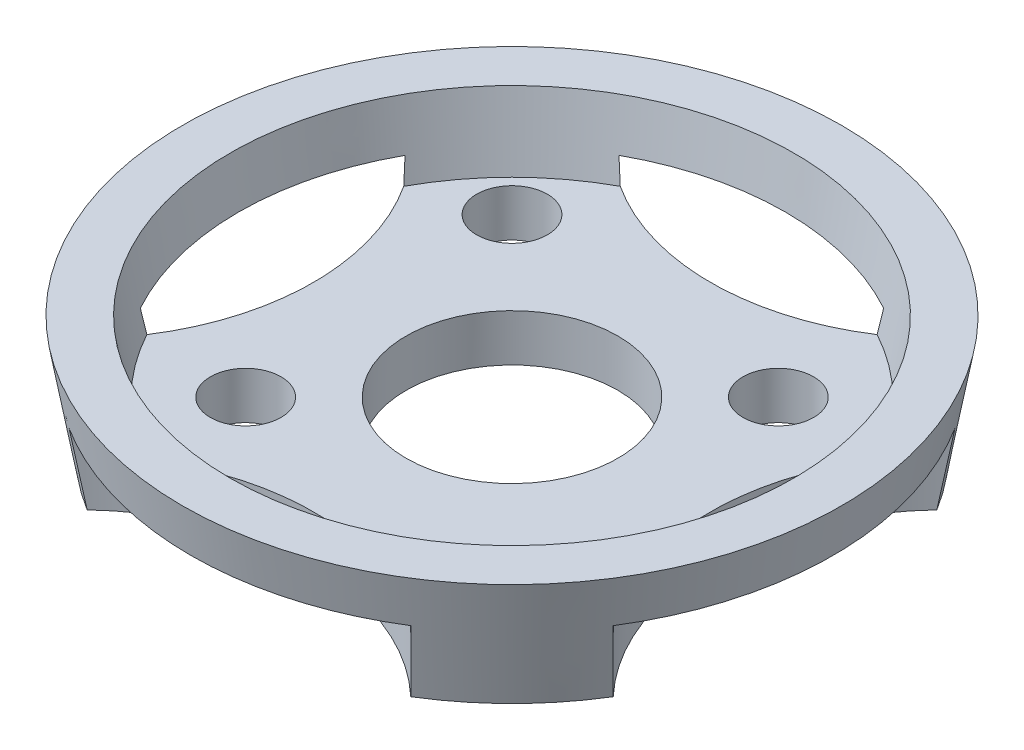
ISO-10303-21;
HEADER;
FILE_DESCRIPTION(('STEP AP214'),'2;1');
FILE_NAME('part.step','',(''),(''),'','','');
FILE_SCHEMA(('AUTOMOTIVE_DESIGN { 1 0 10303 214 1 1 1 1 }'));
ENDSEC;
DATA;
#1=APPLICATION_CONTEXT('core data for automotive mechanical design processes');
#2=APPLICATION_PROTOCOL_DEFINITION('international standard','automotive_design',2000,#1);
#3=PRODUCT_CONTEXT('',#1,'mechanical');
#4=PRODUCT('Part','Part','',(#3));
#5=PRODUCT_RELATED_PRODUCT_CATEGORY('part','',(#4));
#6=PRODUCT_DEFINITION_FORMATION('','',#4);
#7=PRODUCT_DEFINITION_CONTEXT('part definition',#1,'design');
#8=PRODUCT_DEFINITION('design','',#6,#7);
#9=PRODUCT_DEFINITION_SHAPE('','',#8);
#10=(LENGTH_UNIT() NAMED_UNIT(*) SI_UNIT(.MILLI.,.METRE.));
#11=(NAMED_UNIT(*) PLANE_ANGLE_UNIT() SI_UNIT($,.RADIAN.));
#12=(NAMED_UNIT(*) SI_UNIT($,.STERADIAN.) SOLID_ANGLE_UNIT());
#13=UNCERTAINTY_MEASURE_WITH_UNIT(LENGTH_MEASURE(1.E-05),#10,'distance_accuracy_value','');
#14=(GEOMETRIC_REPRESENTATION_CONTEXT(3) GLOBAL_UNCERTAINTY_ASSIGNED_CONTEXT((#13)) GLOBAL_UNIT_ASSIGNED_CONTEXT((#10,
#11,#12)) REPRESENTATION_CONTEXT('',''));
#15=CARTESIAN_POINT('',(0.,0.,0.));
#16=DIRECTION('',(0.,0.,1.));
#17=DIRECTION('',(1.,0.,0.));
#18=AXIS2_PLACEMENT_3D('',#15,#16,#17);
#19=CARTESIAN_POINT('',(0.,5.,0.));
#20=DIRECTION('',(0.,1.,0.));
#21=DIRECTION('',(0.,0.,1.));
#22=AXIS2_PLACEMENT_3D('',#19,#20,#21);
#23=PLANE('',#22);
#24=CARTESIAN_POINT('',(0.,5.,0.));
#25=DIRECTION('',(0.,1.,0.));
#26=DIRECTION('',(0.,0.,1.));
#27=AXIS2_PLACEMENT_3D('',#24,#25,#26);
#28=CIRCLE('',#27,11.9691467762285);
#29=CARTESIAN_POINT('',(0.,5.,11.9691467762285));
#30=VERTEX_POINT('',#29);
#31=EDGE_CURVE('E377',#30,#30,#28,.T.);
#32=ORIENTED_EDGE('',*,*,#31,.F.);
#33=EDGE_LOOP('',(#32));
#34=FACE_BOUND('',#33,.T.);
#35=CARTESIAN_POINT('',(0.,5.,0.));
#36=DIRECTION('',(0.,1.,0.));
#37=DIRECTION('',(0.,0.,1.));
#38=AXIS2_PLACEMENT_3D('',#35,#36,#37);
#39=CIRCLE('',#38,14.);
#40=CARTESIAN_POINT('',(0.,5.,14.));
#41=VERTEX_POINT('',#40);
#42=EDGE_CURVE('E373',#41,#41,#39,.T.);
#43=ORIENTED_EDGE('',*,*,#42,.T.);
#44=EDGE_LOOP('',(#43));
#45=FACE_BOUND('',#44,.T.);
#46=ADVANCED_FACE('F33',(#34,#45),#23,.T.);
#47=CARTESIAN_POINT('',(0.,0.,0.));
#48=DIRECTION('',(0.,1.,0.));
#49=DIRECTION('',(0.,0.,1.));
#50=AXIS2_PLACEMENT_3D('',#47,#48,#49);
#51=PLANE('',#50);
#52=CARTESIAN_POINT('',(6.71751442127195,0.,6.71751442127245));
#53=DIRECTION('',(0.,-1.,0.));
#54=DIRECTION('',(0.,0.,-1.));
#55=AXIS2_PLACEMENT_3D('',#52,#53,#54);
#56=CIRCLE('',#55,1.5);
#57=CARTESIAN_POINT('',(6.71751442127195,0.,5.21751442127245));
#58=VERTEX_POINT('',#57);
#59=EDGE_CURVE('E415',#58,#58,#56,.T.);
#60=ORIENTED_EDGE('',*,*,#59,.F.);
#61=EDGE_LOOP('',(#60));
#62=FACE_BOUND('',#61,.T.);
#63=CARTESIAN_POINT('',(5.65685424949246,0.,-5.65685424949231));
#64=DIRECTION('',(0.,-1.,0.));
#65=DIRECTION('',(0.,0.,-1.));
#66=AXIS2_PLACEMENT_3D('',#63,#64,#65);
#67=CIRCLE('',#66,1.5);
#68=CARTESIAN_POINT('',(5.65685424949246,0.,-7.15685424949231));
#69=VERTEX_POINT('',#68);
#70=EDGE_CURVE('E427',#69,#69,#67,.T.);
#71=ORIENTED_EDGE('',*,*,#70,.F.);
#72=EDGE_LOOP('',(#71));
#73=FACE_BOUND('',#72,.T.);
#74=CARTESIAN_POINT('',(-6.71751442127228,0.,-6.71751442127213));
#75=DIRECTION('',(0.,-1.,0.));
#76=DIRECTION('',(0.,0.,-1.));
#77=AXIS2_PLACEMENT_3D('',#74,#75,#76);
#78=CIRCLE('',#77,1.5);
#79=CARTESIAN_POINT('',(-6.71751442127228,0.,-8.21751442127213));
#80=VERTEX_POINT('',#79);
#81=EDGE_CURVE('E421',#80,#80,#78,.T.);
#82=ORIENTED_EDGE('',*,*,#81,.F.);
#83=EDGE_LOOP('',(#82));
#84=FACE_BOUND('',#83,.T.);
#85=CARTESIAN_POINT('',(-5.65685424949246,0.,5.65685424949231));
#86=DIRECTION('',(0.,-1.,0.));
#87=DIRECTION('',(0.,0.,-1.));
#88=AXIS2_PLACEMENT_3D('',#85,#86,#87);
#89=CIRCLE('',#88,1.50000000000009);
#90=CARTESIAN_POINT('',(-5.65685424949246,0.,4.15685424949221));
#91=VERTEX_POINT('',#90);
#92=EDGE_CURVE('E408',#91,#91,#89,.T.);
#93=ORIENTED_EDGE('',*,*,#92,.F.);
#94=EDGE_LOOP('',(#93));
#95=FACE_BOUND('',#94,.T.);
#96=CARTESIAN_POINT('',(0.,0.,0.));
#97=DIRECTION('',(0.,-1.,0.));
#98=DIRECTION('',(0.,0.,-1.));
#99=AXIS2_PLACEMENT_3D('',#96,#97,#98);
#100=CIRCLE('',#99,4.5);
#101=CARTESIAN_POINT('',(0.,0.,-4.5));
#102=VERTEX_POINT('',#101);
#103=EDGE_CURVE('E405',#102,#102,#100,.T.);
#104=ORIENTED_EDGE('',*,*,#103,.F.);
#105=EDGE_LOOP('',(#104));
#106=FACE_BOUND('',#105,.T.);
#107=CARTESIAN_POINT('',(0.,0.,0.));
#108=DIRECTION('',(0.,1.,0.));
#109=DIRECTION('',(0.,0.,1.));
#110=AXIS2_PLACEMENT_3D('',#107,#108,#109);
#111=CIRCLE('',#110,13.1183650964577);
#112=CARTESIAN_POINT('',(-11.1731705381337,0.,-6.87399177550707));
#113=VERTEX_POINT('',#112);
#114=CARTESIAN_POINT('',(-6.87399177550706,0.,-11.1731705381337));
#115=VERTEX_POINT('',#114);
#116=EDGE_CURVE('E382',#113,#115,#111,.F.);
#117=ORIENTED_EDGE('',*,*,#116,.T.);
#118=CARTESIAN_POINT('',(0.,0.,-18.4359686951984));
#119=DIRECTION('',(0.,-1.,0.));
#120=DIRECTION('',(0.,0.,-1.));
#121=AXIS2_PLACEMENT_3D('',#118,#119,#120);
#122=CIRCLE('',#121,10.);
#123=CARTESIAN_POINT('',(6.87399177550707,0.,-11.1731705381337));
#124=VERTEX_POINT('',#123);
#125=EDGE_CURVE('E401',#124,#115,#122,.T.);
#126=ORIENTED_EDGE('',*,*,#125,.F.);
#127=CARTESIAN_POINT('',(11.1731705381337,0.,-6.87399177550706));
#128=VERTEX_POINT('',#127);
#129=EDGE_CURVE('E385',#124,#128,#111,.F.);
#130=ORIENTED_EDGE('',*,*,#129,.T.);
#131=CARTESIAN_POINT('',(18.4359686951984,0.,0.));
#132=DIRECTION('',(0.,-1.,0.));
#133=DIRECTION('',(0.,0.,-1.));
#134=AXIS2_PLACEMENT_3D('',#131,#132,#133);
#135=CIRCLE('',#134,10.);
#136=CARTESIAN_POINT('',(11.1731705381337,0.,6.87399177550707));
#137=VERTEX_POINT('',#136);
#138=EDGE_CURVE('E402',#137,#128,#135,.T.);
#139=ORIENTED_EDGE('',*,*,#138,.F.);
#140=CARTESIAN_POINT('',(6.87399177550706,0.,11.1731705381337));
#141=VERTEX_POINT('',#140);
#142=EDGE_CURVE('E457',#137,#141,#111,.F.);
#143=ORIENTED_EDGE('',*,*,#142,.T.);
#144=CARTESIAN_POINT('',(0.,0.,18.4359686951984));
#145=DIRECTION('',(0.,-1.,0.));
#146=DIRECTION('',(0.,0.,-1.));
#147=AXIS2_PLACEMENT_3D('',#144,#145,#146);
#148=CIRCLE('',#147,10.);
#149=CARTESIAN_POINT('',(-6.87399177550706,0.,11.1731705381337));
#150=VERTEX_POINT('',#149);
#151=EDGE_CURVE('E159',#150,#141,#148,.T.);
#152=ORIENTED_EDGE('',*,*,#151,.F.);
#153=CARTESIAN_POINT('',(-11.1731705381337,0.,6.87399177550706));
#154=VERTEX_POINT('',#153);
#155=EDGE_CURVE('E173',#150,#154,#111,.F.);
#156=ORIENTED_EDGE('',*,*,#155,.T.);
#157=CARTESIAN_POINT('',(-18.4359686951984,0.,0.));
#158=DIRECTION('',(0.,-1.,0.));
#159=DIRECTION('',(0.,0.,-1.));
#160=AXIS2_PLACEMENT_3D('',#157,#158,#159);
#161=CIRCLE('',#160,10.);
#162=EDGE_CURVE('E303',#113,#154,#161,.T.);
#163=ORIENTED_EDGE('',*,*,#162,.F.);
#164=EDGE_LOOP('',(#117,#126,#130,#139,#143,#152,#156,#163));
#165=FACE_BOUND('',#164,.T.);
#166=ADVANCED_FACE('F438',(#62,#73,#84,#95,#106,#165),#51,.F.);
#167=CARTESIAN_POINT('',(0.,5.00000000000014,0.));
#168=DIRECTION('',(0.,1.,0.));
#169=DIRECTION('',(0.,0.,1.));
#170=AXIS2_PLACEMENT_3D('',#167,#168,#169);
#171=CONICAL_SURFACE('',#170,14.,0.17453292519943);
#172=CARTESIAN_POINT('',(7.25826379044069,3.00020000000002,-11.5571892432623));
#173=CARTESIAN_POINT('',(7.19641335787994,2.50001550835504,-11.4919016928891));
#174=CARTESIAN_POINT('',(7.13346326431379,1.99988992950173,-11.4272542678514));
#175=CARTESIAN_POINT('',(7.0053637550157,0.999756596168105,-11.299239668292));
#176=CARTESIAN_POINT('',(6.94021433927843,0.499748841688082,-11.2358724937735));
#177=CARTESIAN_POINT('',(6.87396526253045,-0.000199999999999041,-11.1731454445936));
#178=B_SPLINE_CURVE_WITH_KNOTS('',3,(#172,#173,#174,#175,#176,#177),.UNSPECIFIED.,.F.,.F.,(4,2,
4),(0.,1.52460105804969,3.04920211978935),.UNSPECIFIED.);
#179=CARTESIAN_POINT('',(7.25823904975278,3.,-11.5571631377891));
#180=VERTEX_POINT('',#179);
#181=EDGE_CURVE('E292',#180,#124,#178,.T.);
#182=ORIENTED_EDGE('',*,*,#181,.F.);
#183=CARTESIAN_POINT('',(0.,3.,0.));
#184=DIRECTION('',(0.,-1.,0.));
#185=DIRECTION('',(0.,0.,-1.));
#186=AXIS2_PLACEMENT_3D('',#183,#184,#185);
#187=CIRCLE('',#186,13.647346038583);
#188=CARTESIAN_POINT('',(-7.25823904975277,3.,-11.5571631377891));
#189=VERTEX_POINT('',#188);
#190=EDGE_CURVE('E354',#180,#189,#187,.F.);
#191=ORIENTED_EDGE('',*,*,#190,.T.);
#192=CARTESIAN_POINT('',(-6.87396526253044,-0.000199999999999856,-11.1731454445936));
#193=CARTESIAN_POINT('',(-6.94021433927843,0.499748841688082,-11.2358724937735));
#194=CARTESIAN_POINT('',(-7.0053637550157,0.999756596168105,-11.299239668292));
#195=CARTESIAN_POINT('',(-7.13346326431379,1.99988992950173,-11.4272542678514));
#196=CARTESIAN_POINT('',(-7.19641335787994,2.50001550835504,-11.4919016928891));
#197=CARTESIAN_POINT('',(-7.25826379044069,3.00020000000002,-11.5571892432623));
#198=B_SPLINE_CURVE_WITH_KNOTS('',3,(#192,#193,#194,#195,#196,#197),.UNSPECIFIED.,.F.,.F.,(4,2,
4),(0.,1.52460106173966,3.04920211978935),.UNSPECIFIED.);
#199=EDGE_CURVE('E286',#115,#189,#198,.T.);
#200=ORIENTED_EDGE('',*,*,#199,.F.);
#201=ORIENTED_EDGE('',*,*,#116,.F.);
#202=CARTESIAN_POINT('',(-11.5571892432623,3.00020000000002,-7.2582637904407));
#203=CARTESIAN_POINT('',(-11.4919016928891,2.50001550835505,-7.19641335787994));
#204=CARTESIAN_POINT('',(-11.4272542678514,1.99988992950173,-7.13346326431379));
#205=CARTESIAN_POINT('',(-11.299239668292,0.999756596168105,-7.0053637550157));
#206=CARTESIAN_POINT('',(-11.2358724937735,0.499748841688082,-6.94021433927843));
#207=CARTESIAN_POINT('',(-11.1731454445936,-0.000199999999999661,-6.87396526253045));
#208=B_SPLINE_CURVE_WITH_KNOTS('',3,(#202,#203,#204,#205,#206,#207),.UNSPECIFIED.,.F.,.F.,(4,2,
4),(0.,1.52460105804969,3.04920211978935),.UNSPECIFIED.);
#209=CARTESIAN_POINT('',(-11.5571631377891,3.,-7.25823904975278));
#210=VERTEX_POINT('',#209);
#211=EDGE_CURVE('E318',#210,#113,#208,.T.);
#212=ORIENTED_EDGE('',*,*,#211,.F.);
#213=CARTESIAN_POINT('',(0.,3.,0.));
#214=DIRECTION('',(0.,-1.,0.));
#215=DIRECTION('',(0.,0.,-1.));
#216=AXIS2_PLACEMENT_3D('',#213,#214,#215);
#217=CIRCLE('',#216,13.647346038583);
#218=CARTESIAN_POINT('',(-11.5571631377891,3.,7.25823904975278));
#219=VERTEX_POINT('',#218);
#220=EDGE_CURVE('E306',#210,#219,#217,.F.);
#221=ORIENTED_EDGE('',*,*,#220,.T.);
#222=CARTESIAN_POINT('',(-11.1731454445936,-0.000199999999999856,6.87396526253044));
#223=CARTESIAN_POINT('',(-11.2358724937735,0.499748841688082,6.94021433927843));
#224=CARTESIAN_POINT('',(-11.299239668292,0.999756596168105,7.0053637550157));
#225=CARTESIAN_POINT('',(-11.4272542678514,1.99988992950173,7.13346326431379));
#226=CARTESIAN_POINT('',(-11.4919016928891,2.50001550835505,7.19641335787994));
#227=CARTESIAN_POINT('',(-11.5571892432623,3.00020000000002,7.25826379044069));
#228=B_SPLINE_CURVE_WITH_KNOTS('',3,(#222,#223,#224,#225,#226,#227),.UNSPECIFIED.,.F.,.F.,(4,2,
4),(0.,1.52460106173966,3.04920211978935),.UNSPECIFIED.);
#229=EDGE_CURVE('E311',#154,#219,#228,.T.);
#230=ORIENTED_EDGE('',*,*,#229,.F.);
#231=ORIENTED_EDGE('',*,*,#155,.F.);
#232=CARTESIAN_POINT('',(-7.25826379044069,3.00020000000002,11.5571892432623));
#233=CARTESIAN_POINT('',(-7.19641335787994,2.50001550835505,11.4919016928891));
#234=CARTESIAN_POINT('',(-7.13346326431379,1.99988992950173,11.4272542678514));
#235=CARTESIAN_POINT('',(-7.0053637550157,0.999756596168105,11.299239668292));
#236=CARTESIAN_POINT('',(-6.94021433927843,0.499748841688082,11.2358724937735));
#237=CARTESIAN_POINT('',(-6.87396526253045,-0.000199999999999857,11.1731454445936));
#238=B_SPLINE_CURVE_WITH_KNOTS('',3,(#232,#233,#234,#235,#236,#237),.UNSPECIFIED.,.F.,.F.,(4,2,
4),(0.,1.52460105804969,3.04920211978935),.UNSPECIFIED.);
#239=CARTESIAN_POINT('',(-7.25823904975278,3.,11.5571631377891));
#240=VERTEX_POINT('',#239);
#241=EDGE_CURVE('E163',#240,#150,#238,.T.);
#242=ORIENTED_EDGE('',*,*,#241,.F.);
#243=CARTESIAN_POINT('',(0.,3.,0.));
#244=DIRECTION('',(0.,-1.,0.));
#245=DIRECTION('',(0.,0.,-1.));
#246=AXIS2_PLACEMENT_3D('',#243,#244,#245);
#247=CIRCLE('',#246,13.647346038583);
#248=CARTESIAN_POINT('',(7.25823904975278,3.,11.5571631377891));
#249=VERTEX_POINT('',#248);
#250=EDGE_CURVE('E147',#240,#249,#247,.F.);
#251=ORIENTED_EDGE('',*,*,#250,.T.);
#252=CARTESIAN_POINT('',(6.87396526253045,-0.000199999999999616,11.1731454445936));
#253=CARTESIAN_POINT('',(6.94021433927843,0.499748841688082,11.2358724937735));
#254=CARTESIAN_POINT('',(7.0053637550157,0.999756596168105,11.299239668292));
#255=CARTESIAN_POINT('',(7.13346326431379,1.99988992950173,11.4272542678514));
#256=CARTESIAN_POINT('',(7.19641335787994,2.50001550835504,11.4919016928891));
#257=CARTESIAN_POINT('',(7.25826379044069,3.00020000000002,11.5571892432623));
#258=B_SPLINE_CURVE_WITH_KNOTS('',3,(#252,#253,#254,#255,#256,#257),.UNSPECIFIED.,.F.,.F.,(4,2,
4),(0.,1.52460106173966,3.04920211978935),.UNSPECIFIED.);
#259=EDGE_CURVE('E175',#141,#249,#258,.T.);
#260=ORIENTED_EDGE('',*,*,#259,.F.);
#261=ORIENTED_EDGE('',*,*,#142,.F.);
#262=CARTESIAN_POINT('',(11.5571892432623,3.00020000000002,7.25826379044069));
#263=CARTESIAN_POINT('',(11.4919016928891,2.50001550835505,7.19641335787994));
#264=CARTESIAN_POINT('',(11.4272542678514,1.99988992950173,7.13346326431379));
#265=CARTESIAN_POINT('',(11.299239668292,0.999756596168105,7.0053637550157));
#266=CARTESIAN_POINT('',(11.2358724937735,0.499748841688082,6.94021433927843));
#267=CARTESIAN_POINT('',(11.1731454445936,-0.00019999999999992,6.87396526253045));
#268=B_SPLINE_CURVE_WITH_KNOTS('',3,(#262,#263,#264,#265,#266,#267),.UNSPECIFIED.,.F.,.F.,(4,2,
4),(0.,1.52460105804969,3.04920211978935),.UNSPECIFIED.);
#269=CARTESIAN_POINT('',(11.5571631377891,3.,7.25823904975278));
#270=VERTEX_POINT('',#269);
#271=EDGE_CURVE('E349',#270,#137,#268,.T.);
#272=ORIENTED_EDGE('',*,*,#271,.F.);
#273=CARTESIAN_POINT('',(0.,3.,0.));
#274=DIRECTION('',(0.,-1.,0.));
#275=DIRECTION('',(0.,0.,-1.));
#276=AXIS2_PLACEMENT_3D('',#273,#274,#275);
#277=CIRCLE('',#276,13.647346038583);
#278=CARTESIAN_POINT('',(11.5571631377891,3.,-7.25823904975278));
#279=VERTEX_POINT('',#278);
#280=EDGE_CURVE('E174',#270,#279,#277,.F.);
#281=ORIENTED_EDGE('',*,*,#280,.T.);
#282=CARTESIAN_POINT('',(11.1731454445936,-0.000199999999999616,-6.87396526253045));
#283=CARTESIAN_POINT('',(11.2358724937735,0.499748841688082,-6.94021433927843));
#284=CARTESIAN_POINT('',(11.299239668292,0.999756596168105,-7.0053637550157));
#285=CARTESIAN_POINT('',(11.4272542678514,1.99988992950173,-7.13346326431379));
#286=CARTESIAN_POINT('',(11.4919016928891,2.50001550835504,-7.19641335787994));
#287=CARTESIAN_POINT('',(11.5571892432623,3.00020000000002,-7.25826379044069));
#288=B_SPLINE_CURVE_WITH_KNOTS('',3,(#282,#283,#284,#285,#286,#287),.UNSPECIFIED.,.F.,.F.,(4,2,
4),(0.,1.52460106173966,3.04920211978935),.UNSPECIFIED.);
#289=EDGE_CURVE('E344',#128,#279,#288,.T.);
#290=ORIENTED_EDGE('',*,*,#289,.F.);
#291=ORIENTED_EDGE('',*,*,#129,.F.);
#292=EDGE_LOOP('',(#182,#191,#200,#201,#212,#221,#230,#231,#242,#251,#260,#261,#272,#281,#290,#291));
#293=FACE_BOUND('',#292,.T.);
#294=ORIENTED_EDGE('',*,*,#42,.F.);
#295=EDGE_LOOP('',(#294));
#296=FACE_BOUND('',#295,.T.);
#297=ADVANCED_FACE('F35',(#293,#296),#171,.T.);
#298=CARTESIAN_POINT('',(0.,2.,0.));
#299=DIRECTION('',(0.,1.,0.));
#300=DIRECTION('',(0.,0.,1.));
#301=AXIS2_PLACEMENT_3D('',#298,#299,#300);
#302=PLANE('',#301);
#303=CARTESIAN_POINT('',(6.71751442127195,2.,6.71751442127245));
#304=DIRECTION('',(0.,1.,0.));
#305=DIRECTION('',(0.,0.,1.));
#306=AXIS2_PLACEMENT_3D('',#303,#304,#305);
#307=CIRCLE('',#306,1.5);
#308=CARTESIAN_POINT('',(6.71751442127195,2.,8.21751442127245));
#309=VERTEX_POINT('',#308);
#310=EDGE_CURVE('E430',#309,#309,#307,.F.);
#311=ORIENTED_EDGE('',*,*,#310,.T.);
#312=EDGE_LOOP('',(#311));
#313=FACE_BOUND('',#312,.T.);
#314=CARTESIAN_POINT('',(5.65685424949246,2.,-5.65685424949231));
#315=DIRECTION('',(0.,1.,0.));
#316=DIRECTION('',(0.,0.,1.));
#317=AXIS2_PLACEMENT_3D('',#314,#315,#316);
#318=CIRCLE('',#317,1.5);
#319=CARTESIAN_POINT('',(5.65685424949246,2.,-4.1568542494923));
#320=VERTEX_POINT('',#319);
#321=EDGE_CURVE('E424',#320,#320,#318,.F.);
#322=ORIENTED_EDGE('',*,*,#321,.T.);
#323=EDGE_LOOP('',(#322));
#324=FACE_BOUND('',#323,.T.);
#325=CARTESIAN_POINT('',(-6.71751442127228,2.,-6.71751442127213));
#326=DIRECTION('',(0.,1.,0.));
#327=DIRECTION('',(0.,0.,1.));
#328=AXIS2_PLACEMENT_3D('',#325,#326,#327);
#329=CIRCLE('',#328,1.5);
#330=CARTESIAN_POINT('',(-6.71751442127228,2.,-5.21751442127213));
#331=VERTEX_POINT('',#330);
#332=EDGE_CURVE('E418',#331,#331,#329,.F.);
#333=ORIENTED_EDGE('',*,*,#332,.T.);
#334=EDGE_LOOP('',(#333));
#335=FACE_BOUND('',#334,.T.);
#336=CARTESIAN_POINT('',(-5.65685424949246,2.,5.65685424949231));
#337=DIRECTION('',(0.,1.,0.));
#338=DIRECTION('',(0.,0.,1.));
#339=AXIS2_PLACEMENT_3D('',#336,#337,#338);
#340=CIRCLE('',#339,1.50000000000009);
#341=CARTESIAN_POINT('',(-5.65685424949246,2.,7.1568542494924));
#342=VERTEX_POINT('',#341);
#343=EDGE_CURVE('E412',#342,#342,#340,.F.);
#344=ORIENTED_EDGE('',*,*,#343,.T.);
#345=EDGE_LOOP('',(#344));
#346=FACE_BOUND('',#345,.T.);
#347=CARTESIAN_POINT('',(0.,2.,0.));
#348=DIRECTION('',(0.,1.,0.));
#349=DIRECTION('',(0.,0.,1.));
#350=AXIS2_PLACEMENT_3D('',#347,#348,#349);
#351=CIRCLE('',#350,4.5);
#352=CARTESIAN_POINT('',(0.,2.,4.5));
#353=VERTEX_POINT('',#352);
#354=EDGE_CURVE('E38',#353,#353,#351,.T.);
#355=ORIENTED_EDGE('',*,*,#354,.F.);
#356=EDGE_LOOP('',(#355));
#357=FACE_BOUND('',#356,.T.);
#358=CARTESIAN_POINT('',(0.,2.,-18.4359686951984));
#359=DIRECTION('',(0.,1.,0.));
#360=DIRECTION('',(0.,0.,1.));
#361=AXIS2_PLACEMENT_3D('',#358,#359,#360);
#362=CIRCLE('',#361,10.);
#363=CARTESIAN_POINT('',(-5.45583953974631,2.,-10.0554069648285));
#364=VERTEX_POINT('',#363);
#365=CARTESIAN_POINT('',(5.45583953974631,2.,-10.0554069648285));
#366=VERTEX_POINT('',#365);
#367=EDGE_CURVE('E293',#364,#366,#362,.T.);
#368=ORIENTED_EDGE('',*,*,#367,.F.);
#369=CARTESIAN_POINT('',(0.,2.,0.));
#370=DIRECTION('',(0.,1.,0.));
#371=DIRECTION('',(0.,0.,1.));
#372=AXIS2_PLACEMENT_3D('',#369,#370,#371);
#373=CIRCLE('',#372,11.4401658341031);
#374=CARTESIAN_POINT('',(-10.0554069648285,2.,-5.45583953974632));
#375=VERTEX_POINT('',#374);
#376=EDGE_CURVE('E371',#375,#364,#373,.F.);
#377=ORIENTED_EDGE('',*,*,#376,.F.);
#378=CARTESIAN_POINT('',(-18.4359686951984,2.,0.));
#379=DIRECTION('',(0.,1.,0.));
#380=DIRECTION('',(0.,0.,1.));
#381=AXIS2_PLACEMENT_3D('',#378,#379,#380);
#382=CIRCLE('',#381,10.);
#383=CARTESIAN_POINT('',(-10.0554069648285,2.,5.45583953974631));
#384=VERTEX_POINT('',#383);
#385=EDGE_CURVE('E309',#384,#375,#382,.T.);
#386=ORIENTED_EDGE('',*,*,#385,.F.);
#387=CARTESIAN_POINT('',(-5.45583953974631,2.,10.0554069648285));
#388=VERTEX_POINT('',#387);
#389=EDGE_CURVE('E374',#388,#384,#373,.F.);
#390=ORIENTED_EDGE('',*,*,#389,.F.);
#391=CARTESIAN_POINT('',(0.,2.,18.4359686951984));
#392=DIRECTION('',(0.,1.,0.));
#393=DIRECTION('',(0.,0.,1.));
#394=AXIS2_PLACEMENT_3D('',#391,#392,#393);
#395=CIRCLE('',#394,10.);
#396=CARTESIAN_POINT('',(5.45583953974631,2.,10.0554069648285));
#397=VERTEX_POINT('',#396);
#398=EDGE_CURVE('E158',#397,#388,#395,.T.);
#399=ORIENTED_EDGE('',*,*,#398,.F.);
#400=CARTESIAN_POINT('',(10.0554069648285,2.,5.45583953974631));
#401=VERTEX_POINT('',#400);
#402=EDGE_CURVE('E372',#401,#397,#373,.F.);
#403=ORIENTED_EDGE('',*,*,#402,.F.);
#404=CARTESIAN_POINT('',(18.4359686951984,2.,0.));
#405=DIRECTION('',(0.,1.,0.));
#406=DIRECTION('',(0.,0.,1.));
#407=AXIS2_PLACEMENT_3D('',#404,#405,#406);
#408=CIRCLE('',#407,10.);
#409=CARTESIAN_POINT('',(10.0554069648285,2.,-5.45583953974631));
#410=VERTEX_POINT('',#409);
#411=EDGE_CURVE('E178',#410,#401,#408,.T.);
#412=ORIENTED_EDGE('',*,*,#411,.F.);
#413=EDGE_CURVE('E368',#366,#410,#373,.F.);
#414=ORIENTED_EDGE('',*,*,#413,.F.);
#415=EDGE_LOOP('',(#368,#377,#386,#390,#399,#403,#412,#414));
#416=FACE_BOUND('',#415,.T.);
#417=ADVANCED_FACE('F225',(#313,#324,#335,#346,#357,#416),#302,.T.);
#418=CARTESIAN_POINT('',(0.,5.347296355334,0.));
#419=DIRECTION('',(0.,1.,0.));
#420=DIRECTION('',(0.,0.,1.));
#421=AXIS2_PLACEMENT_3D('',#418,#419,#420);
#422=CONICAL_SURFACE('',#421,12.0303844939756,0.17453292519943);
#423=CARTESIAN_POINT('',(0.,3.,0.));
#424=DIRECTION('',(0.,-1.,0.));
#425=DIRECTION('',(0.,0.,-1.));
#426=AXIS2_PLACEMENT_3D('',#423,#424,#425);
#427=CIRCLE('',#426,11.6164928148116);
#428=CARTESIAN_POINT('',(5.6215757850969,3.,-10.1656672682604));
#429=VERTEX_POINT('',#428);
#430=CARTESIAN_POINT('',(-5.6215757850969,3.,-10.1656672682604));
#431=VERTEX_POINT('',#430);
#432=EDGE_CURVE('E267',#429,#431,#427,.F.);
#433=ORIENTED_EDGE('',*,*,#432,.F.);
#434=CARTESIAN_POINT('',(5.62160847547281,3.0002,-10.1656894889991));
#435=CARTESIAN_POINT('',(5.59435224634309,2.83342016988337,-10.1471596449865));
#436=CARTESIAN_POINT('',(5.56690725259974,2.66666358824815,-10.1287026890272));
#437=CARTESIAN_POINT('',(5.51163973582627,2.33319692158138,-10.0919345531758));
#438=CARTESIAN_POINT('',(5.48381721279534,2.16648683654993,-10.0736233732839));
#439=CARTESIAN_POINT('',(5.45580592514996,1.9998,-10.0553850814458));
#440=B_SPLINE_CURVE_WITH_KNOTS('',3,(#434,#435,#436,#437,#438,#439),.UNSPECIFIED.,.F.,.F.,(4,2,
4),(0.,0.510014509412881,1.02002901992437),.UNSPECIFIED.);
#441=EDGE_CURVE('E11',#429,#366,#440,.T.);
#442=ORIENTED_EDGE('',*,*,#441,.T.);
#443=ORIENTED_EDGE('',*,*,#413,.T.);
#444=CARTESIAN_POINT('',(10.0553850814458,1.9998,-5.45580592514996));
#445=CARTESIAN_POINT('',(10.0736233732839,2.16648683654993,-5.48381721279533));
#446=CARTESIAN_POINT('',(10.0919345531758,2.33319692158138,-5.51163973582627));
#447=CARTESIAN_POINT('',(10.1287026890272,2.66666358824815,-5.56690725259974));
#448=CARTESIAN_POINT('',(10.1471596449865,2.83342016988337,-5.59435224634309));
#449=CARTESIAN_POINT('',(10.1656894889991,3.0002,-5.62160847547281));
#450=B_SPLINE_CURVE_WITH_KNOTS('',3,(#444,#445,#446,#447,#448,#449),.UNSPECIFIED.,.F.,.F.,(4,2,
4),(0.,0.510014510511492,1.02002901992437),.UNSPECIFIED.);
#451=CARTESIAN_POINT('',(10.1656672682604,3.,-5.6215757850969));
#452=VERTEX_POINT('',#451);
#453=EDGE_CURVE('E248',#410,#452,#450,.T.);
#454=ORIENTED_EDGE('',*,*,#453,.T.);
#455=CARTESIAN_POINT('',(0.,3.,0.));
#456=DIRECTION('',(0.,-1.,0.));
#457=DIRECTION('',(0.,0.,-1.));
#458=AXIS2_PLACEMENT_3D('',#455,#456,#457);
#459=CIRCLE('',#458,11.6164928148116);
#460=CARTESIAN_POINT('',(10.1656672682604,3.,5.6215757850969));
#461=VERTEX_POINT('',#460);
#462=EDGE_CURVE('E217',#461,#452,#459,.F.);
#463=ORIENTED_EDGE('',*,*,#462,.F.);
#464=CARTESIAN_POINT('',(10.1656894889991,3.0002,5.62160847547281));
#465=CARTESIAN_POINT('',(10.1471596449865,2.83342016988337,5.59435224634309));
#466=CARTESIAN_POINT('',(10.1287026890272,2.66666358824815,5.56690725259974));
#467=CARTESIAN_POINT('',(10.0919345531758,2.33319692158138,5.51163973582627));
#468=CARTESIAN_POINT('',(10.0736233732839,2.16648683654993,5.48381721279534));
#469=CARTESIAN_POINT('',(10.0553850814458,1.9998,5.45580592514996));
#470=B_SPLINE_CURVE_WITH_KNOTS('',3,(#464,#465,#466,#467,#468,#469),.UNSPECIFIED.,.F.,.F.,(4,2,
4),(0.,0.510014509412882,1.02002901992437),.UNSPECIFIED.);
#471=EDGE_CURVE('E254',#461,#401,#470,.T.);
#472=ORIENTED_EDGE('',*,*,#471,.T.);
#473=ORIENTED_EDGE('',*,*,#402,.T.);
#474=CARTESIAN_POINT('',(5.45580592514996,1.9998,10.0553850814458));
#475=CARTESIAN_POINT('',(5.48381721279533,2.16648683654993,10.0736233732839));
#476=CARTESIAN_POINT('',(5.51163973582627,2.33319692158138,10.0919345531758));
#477=CARTESIAN_POINT('',(5.56690725259974,2.66666358824815,10.1287026890272));
#478=CARTESIAN_POINT('',(5.59435224634309,2.83342016988337,10.1471596449865));
#479=CARTESIAN_POINT('',(5.62160847547282,3.0002,10.1656894889991));
#480=B_SPLINE_CURVE_WITH_KNOTS('',3,(#474,#475,#476,#477,#478,#479),.UNSPECIFIED.,.F.,.F.,(4,2,
4),(0.,0.510014510511491,1.02002901992437),.UNSPECIFIED.);
#481=CARTESIAN_POINT('',(5.6215757850969,3.,10.1656672682604));
#482=VERTEX_POINT('',#481);
#483=EDGE_CURVE('E203',#397,#482,#480,.T.);
#484=ORIENTED_EDGE('',*,*,#483,.T.);
#485=CARTESIAN_POINT('',(0.,3.,0.));
#486=DIRECTION('',(0.,-1.,0.));
#487=DIRECTION('',(0.,0.,-1.));
#488=AXIS2_PLACEMENT_3D('',#485,#486,#487);
#489=CIRCLE('',#488,11.6164928148116);
#490=CARTESIAN_POINT('',(-5.6215757850969,3.,10.1656672682604));
#491=VERTEX_POINT('',#490);
#492=EDGE_CURVE('E391',#491,#482,#489,.F.);
#493=ORIENTED_EDGE('',*,*,#492,.F.);
#494=CARTESIAN_POINT('',(-5.62160847547281,3.0002,10.1656894889991));
#495=CARTESIAN_POINT('',(-5.59435224634309,2.83342016988337,10.1471596449865));
#496=CARTESIAN_POINT('',(-5.56690725259974,2.66666358824815,10.1287026890272));
#497=CARTESIAN_POINT('',(-5.51163973582627,2.33319692158138,10.0919345531758));
#498=CARTESIAN_POINT('',(-5.48381721279534,2.16648683654993,10.0736233732839));
#499=CARTESIAN_POINT('',(-5.45580592514996,1.9998,10.0553850814458));
#500=B_SPLINE_CURVE_WITH_KNOTS('',3,(#494,#495,#496,#497,#498,#499),.UNSPECIFIED.,.F.,.F.,(4,2,
4),(0.,0.510014509412882,1.02002901992437),.UNSPECIFIED.);
#501=EDGE_CURVE('E166',#491,#388,#500,.T.);
#502=ORIENTED_EDGE('',*,*,#501,.T.);
#503=ORIENTED_EDGE('',*,*,#389,.T.);
#504=CARTESIAN_POINT('',(-10.0553850814458,1.9998,5.45580592514996));
#505=CARTESIAN_POINT('',(-10.0736233732839,2.16648683654993,5.48381721279533));
#506=CARTESIAN_POINT('',(-10.0919345531758,2.33319692158138,5.51163973582627));
#507=CARTESIAN_POINT('',(-10.1287026890272,2.66666358824815,5.56690725259974));
#508=CARTESIAN_POINT('',(-10.1471596449865,2.83342016988337,5.59435224634309));
#509=CARTESIAN_POINT('',(-10.1656894889991,3.0002,5.62160847547281));
#510=B_SPLINE_CURVE_WITH_KNOTS('',3,(#504,#505,#506,#507,#508,#509),.UNSPECIFIED.,.F.,.F.,(4,2,
4),(0.,0.51001451051149,1.02002901992437),.UNSPECIFIED.);
#511=CARTESIAN_POINT('',(-10.1656672682604,3.,5.6215757850969));
#512=VERTEX_POINT('',#511);
#513=EDGE_CURVE('E231',#384,#512,#510,.T.);
#514=ORIENTED_EDGE('',*,*,#513,.T.);
#515=CARTESIAN_POINT('',(0.,3.,0.));
#516=DIRECTION('',(0.,-1.,0.));
#517=DIRECTION('',(0.,0.,-1.));
#518=AXIS2_PLACEMENT_3D('',#515,#516,#517);
#519=CIRCLE('',#518,11.6164928148116);
#520=CARTESIAN_POINT('',(-10.1656672682604,3.,-5.6215757850969));
#521=VERTEX_POINT('',#520);
#522=EDGE_CURVE('E384',#521,#512,#519,.F.);
#523=ORIENTED_EDGE('',*,*,#522,.F.);
#524=CARTESIAN_POINT('',(-10.1656894889991,3.0002,-5.62160847547281));
#525=CARTESIAN_POINT('',(-10.1471596449865,2.83342016988337,-5.59435224634309));
#526=CARTESIAN_POINT('',(-10.1287026890272,2.66666358824815,-5.56690725259974));
#527=CARTESIAN_POINT('',(-10.0919345531758,2.33319692158138,-5.51163973582627));
#528=CARTESIAN_POINT('',(-10.0736233732839,2.16648683654993,-5.48381721279534));
#529=CARTESIAN_POINT('',(-10.0553850814458,1.9998,-5.45580592514996));
#530=B_SPLINE_CURVE_WITH_KNOTS('',3,(#524,#525,#526,#527,#528,#529),.UNSPECIFIED.,.F.,.F.,(4,2,
4),(0.,0.510014509412881,1.02002901992437),.UNSPECIFIED.);
#531=EDGE_CURVE('E240',#521,#375,#530,.T.);
#532=ORIENTED_EDGE('',*,*,#531,.T.);
#533=ORIENTED_EDGE('',*,*,#376,.T.);
#534=CARTESIAN_POINT('',(-5.45580592514995,1.9998,-10.0553850814458));
#535=CARTESIAN_POINT('',(-5.48381721279533,2.16648683654993,-10.0736233732839));
#536=CARTESIAN_POINT('',(-5.51163973582627,2.33319692158138,-10.0919345531758));
#537=CARTESIAN_POINT('',(-5.56690725259974,2.66666358824815,-10.1287026890272));
#538=CARTESIAN_POINT('',(-5.59435224634309,2.83342016988336,-10.1471596449865));
#539=CARTESIAN_POINT('',(-5.62160847547281,3.0002,-10.1656894889991));
#540=B_SPLINE_CURVE_WITH_KNOTS('',3,(#534,#535,#536,#537,#538,#539),.UNSPECIFIED.,.F.,.F.,(4,2,
4),(0.,0.51001451051149,1.02002901992437),.UNSPECIFIED.);
#541=EDGE_CURVE('E43',#364,#431,#540,.T.);
#542=ORIENTED_EDGE('',*,*,#541,.T.);
#543=EDGE_LOOP('',(#433,#442,#443,#454,#463,#472,#473,#484,#493,#502,#503,#514,#523,#532,#533,#542));
#544=FACE_BOUND('',#543,.T.);
#545=ORIENTED_EDGE('',*,*,#31,.T.);
#546=EDGE_LOOP('',(#545));
#547=FACE_BOUND('',#546,.T.);
#548=ADVANCED_FACE('F219',(#544,#547),#422,.F.);
#549=CARTESIAN_POINT('',(-18.4359686951984,3.,0.));
#550=DIRECTION('',(0.,-1.,0.));
#551=DIRECTION('',(0.,0.,-1.));
#552=AXIS2_PLACEMENT_3D('',#549,#550,#551);
#553=CYLINDRICAL_SURFACE('',#552,10.);
#554=ORIENTED_EDGE('',*,*,#211,.T.);
#555=ORIENTED_EDGE('',*,*,#162,.T.);
#556=ORIENTED_EDGE('',*,*,#229,.T.);
#557=CARTESIAN_POINT('',(-18.4359686951984,3.,0.));
#558=DIRECTION('',(0.,-1.,0.));
#559=DIRECTION('',(0.,0.,-1.));
#560=AXIS2_PLACEMENT_3D('',#557,#558,#559);
#561=CIRCLE('',#560,10.);
#562=EDGE_CURVE('E300',#512,#219,#561,.T.);
#563=ORIENTED_EDGE('',*,*,#562,.F.);
#564=ORIENTED_EDGE('',*,*,#513,.F.);
#565=ORIENTED_EDGE('',*,*,#385,.T.);
#566=ORIENTED_EDGE('',*,*,#531,.F.);
#567=EDGE_CURVE('E302',#210,#521,#561,.T.);
#568=ORIENTED_EDGE('',*,*,#567,.F.);
#569=EDGE_LOOP('',(#554,#555,#556,#563,#564,#565,#566,#568));
#570=FACE_BOUND('',#569,.T.);
#571=ADVANCED_FACE('F224',(#570),#553,.F.);
#572=CARTESIAN_POINT('',(0.,3.,0.));
#573=DIRECTION('',(0.,-1.,0.));
#574=DIRECTION('',(0.,0.,-1.));
#575=AXIS2_PLACEMENT_3D('',#572,#573,#574);
#576=PLANE('',#575);
#577=ORIENTED_EDGE('',*,*,#567,.T.);
#578=ORIENTED_EDGE('',*,*,#522,.T.);
#579=ORIENTED_EDGE('',*,*,#562,.T.);
#580=ORIENTED_EDGE('',*,*,#220,.F.);
#581=EDGE_LOOP('',(#577,#578,#579,#580));
#582=FACE_BOUND('',#581,.T.);
#583=ADVANCED_FACE('F196',(#582),#576,.T.);
#584=CARTESIAN_POINT('',(0.,3.,18.4359686951984));
#585=DIRECTION('',(0.,-1.,0.));
#586=DIRECTION('',(0.,0.,-1.));
#587=AXIS2_PLACEMENT_3D('',#584,#585,#586);
#588=CYLINDRICAL_SURFACE('',#587,10.);
#589=ORIENTED_EDGE('',*,*,#241,.T.);
#590=ORIENTED_EDGE('',*,*,#151,.T.);
#591=ORIENTED_EDGE('',*,*,#259,.T.);
#592=CARTESIAN_POINT('',(0.,3.,18.4359686951984));
#593=DIRECTION('',(0.,-1.,0.));
#594=DIRECTION('',(0.,0.,-1.));
#595=AXIS2_PLACEMENT_3D('',#592,#593,#594);
#596=CIRCLE('',#595,10.);
#597=EDGE_CURVE('E153',#482,#249,#596,.T.);
#598=ORIENTED_EDGE('',*,*,#597,.F.);
#599=ORIENTED_EDGE('',*,*,#483,.F.);
#600=ORIENTED_EDGE('',*,*,#398,.T.);
#601=ORIENTED_EDGE('',*,*,#501,.F.);
#602=EDGE_CURVE('E150',#240,#491,#596,.T.);
#603=ORIENTED_EDGE('',*,*,#602,.F.);
#604=EDGE_LOOP('',(#589,#590,#591,#598,#599,#600,#601,#603));
#605=FACE_BOUND('',#604,.T.);
#606=ADVANCED_FACE('F162',(#605),#588,.F.);
#607=CARTESIAN_POINT('',(0.,3.,0.));
#608=DIRECTION('',(0.,-1.,0.));
#609=DIRECTION('',(0.,0.,-1.));
#610=AXIS2_PLACEMENT_3D('',#607,#608,#609);
#611=PLANE('',#610);
#612=ORIENTED_EDGE('',*,*,#602,.T.);
#613=ORIENTED_EDGE('',*,*,#492,.T.);
#614=ORIENTED_EDGE('',*,*,#597,.T.);
#615=ORIENTED_EDGE('',*,*,#250,.F.);
#616=EDGE_LOOP('',(#612,#613,#614,#615));
#617=FACE_BOUND('',#616,.T.);
#618=ADVANCED_FACE('F149',(#617),#611,.T.);
#619=CARTESIAN_POINT('',(18.4359686951984,3.,0.));
#620=DIRECTION('',(0.,-1.,0.));
#621=DIRECTION('',(0.,0.,-1.));
#622=AXIS2_PLACEMENT_3D('',#619,#620,#621);
#623=CYLINDRICAL_SURFACE('',#622,10.);
#624=ORIENTED_EDGE('',*,*,#271,.T.);
#625=ORIENTED_EDGE('',*,*,#138,.T.);
#626=ORIENTED_EDGE('',*,*,#289,.T.);
#627=CARTESIAN_POINT('',(18.4359686951984,3.,0.));
#628=DIRECTION('',(0.,-1.,0.));
#629=DIRECTION('',(0.,0.,-1.));
#630=AXIS2_PLACEMENT_3D('',#627,#628,#629);
#631=CIRCLE('',#630,10.);
#632=EDGE_CURVE('E58',#452,#279,#631,.T.);
#633=ORIENTED_EDGE('',*,*,#632,.F.);
#634=ORIENTED_EDGE('',*,*,#453,.F.);
#635=ORIENTED_EDGE('',*,*,#411,.T.);
#636=ORIENTED_EDGE('',*,*,#471,.F.);
#637=EDGE_CURVE('E400',#270,#461,#631,.T.);
#638=ORIENTED_EDGE('',*,*,#637,.F.);
#639=EDGE_LOOP('',(#624,#625,#626,#633,#634,#635,#636,#638));
#640=FACE_BOUND('',#639,.T.);
#641=ADVANCED_FACE('F335',(#640),#623,.F.);
#642=CARTESIAN_POINT('',(0.,3.,0.));
#643=DIRECTION('',(0.,-1.,0.));
#644=DIRECTION('',(0.,0.,-1.));
#645=AXIS2_PLACEMENT_3D('',#642,#643,#644);
#646=PLANE('',#645);
#647=ORIENTED_EDGE('',*,*,#637,.T.);
#648=ORIENTED_EDGE('',*,*,#462,.T.);
#649=ORIENTED_EDGE('',*,*,#632,.T.);
#650=ORIENTED_EDGE('',*,*,#280,.F.);
#651=EDGE_LOOP('',(#647,#648,#649,#650));
#652=FACE_BOUND('',#651,.T.);
#653=ADVANCED_FACE('F277',(#652),#646,.T.);
#654=CARTESIAN_POINT('',(0.,3.,-18.4359686951984));
#655=DIRECTION('',(0.,-1.,0.));
#656=DIRECTION('',(0.,0.,-1.));
#657=AXIS2_PLACEMENT_3D('',#654,#655,#656);
#658=CYLINDRICAL_SURFACE('',#657,10.);
#659=ORIENTED_EDGE('',*,*,#181,.T.);
#660=ORIENTED_EDGE('',*,*,#125,.T.);
#661=ORIENTED_EDGE('',*,*,#199,.T.);
#662=CARTESIAN_POINT('',(0.,3.,-18.4359686951984));
#663=DIRECTION('',(0.,-1.,0.));
#664=DIRECTION('',(0.,0.,-1.));
#665=AXIS2_PLACEMENT_3D('',#662,#663,#664);
#666=CIRCLE('',#665,10.);
#667=EDGE_CURVE('E50',#431,#189,#666,.T.);
#668=ORIENTED_EDGE('',*,*,#667,.F.);
#669=ORIENTED_EDGE('',*,*,#541,.F.);
#670=ORIENTED_EDGE('',*,*,#367,.T.);
#671=ORIENTED_EDGE('',*,*,#441,.F.);
#672=EDGE_CURVE('E410',#180,#429,#666,.T.);
#673=ORIENTED_EDGE('',*,*,#672,.F.);
#674=EDGE_LOOP('',(#659,#660,#661,#668,#669,#670,#671,#673));
#675=FACE_BOUND('',#674,.T.);
#676=ADVANCED_FACE('F272',(#675),#658,.F.);
#677=CARTESIAN_POINT('',(0.,3.,0.));
#678=DIRECTION('',(0.,-1.,0.));
#679=DIRECTION('',(0.,0.,-1.));
#680=AXIS2_PLACEMENT_3D('',#677,#678,#679);
#681=PLANE('',#680);
#682=ORIENTED_EDGE('',*,*,#672,.T.);
#683=ORIENTED_EDGE('',*,*,#432,.T.);
#684=ORIENTED_EDGE('',*,*,#667,.T.);
#685=ORIENTED_EDGE('',*,*,#190,.F.);
#686=EDGE_LOOP('',(#682,#683,#684,#685));
#687=FACE_BOUND('',#686,.T.);
#688=ADVANCED_FACE('F276',(#687),#681,.T.);
#689=CARTESIAN_POINT('',(0.,3.,0.));
#690=DIRECTION('',(0.,-1.,0.));
#691=DIRECTION('',(0.,0.,-1.));
#692=AXIS2_PLACEMENT_3D('',#689,#690,#691);
#693=CYLINDRICAL_SURFACE('',#692,4.5);
#694=ORIENTED_EDGE('',*,*,#354,.T.);
#695=EDGE_LOOP('',(#694));
#696=FACE_BOUND('',#695,.T.);
#697=ORIENTED_EDGE('',*,*,#103,.T.);
#698=EDGE_LOOP('',(#697));
#699=FACE_BOUND('',#698,.T.);
#700=ADVANCED_FACE('F197',(#696,#699),#693,.F.);
#701=CARTESIAN_POINT('',(-5.65685424949246,5.001,5.65685424949231));
#702=DIRECTION('',(0.,-1.,0.));
#703=DIRECTION('',(0.,0.,-1.));
#704=AXIS2_PLACEMENT_3D('',#701,#702,#703);
#705=CYLINDRICAL_SURFACE('',#704,1.50000000000009);
#706=ORIENTED_EDGE('',*,*,#343,.F.);
#707=EDGE_LOOP('',(#706));
#708=FACE_BOUND('',#707,.T.);
#709=ORIENTED_EDGE('',*,*,#92,.T.);
#710=EDGE_LOOP('',(#709));
#711=FACE_BOUND('',#710,.T.);
#712=ADVANCED_FACE('F279',(#708,#711),#705,.F.);
#713=CARTESIAN_POINT('',(-6.71751442127228,5.001,-6.71751442127213));
#714=DIRECTION('',(0.,-1.,0.));
#715=DIRECTION('',(0.,0.,-1.));
#716=AXIS2_PLACEMENT_3D('',#713,#714,#715);
#717=CYLINDRICAL_SURFACE('',#716,1.5);
#718=ORIENTED_EDGE('',*,*,#332,.F.);
#719=EDGE_LOOP('',(#718));
#720=FACE_BOUND('',#719,.T.);
#721=ORIENTED_EDGE('',*,*,#81,.T.);
#722=EDGE_LOOP('',(#721));
#723=FACE_BOUND('',#722,.T.);
#724=ADVANCED_FACE('F498',(#720,#723),#717,.F.);
#725=CARTESIAN_POINT('',(5.65685424949246,5.001,-5.65685424949231));
#726=DIRECTION('',(0.,-1.,0.));
#727=DIRECTION('',(0.,0.,-1.));
#728=AXIS2_PLACEMENT_3D('',#725,#726,#727);
#729=CYLINDRICAL_SURFACE('',#728,1.5);
#730=ORIENTED_EDGE('',*,*,#321,.F.);
#731=EDGE_LOOP('',(#730));
#732=FACE_BOUND('',#731,.T.);
#733=ORIENTED_EDGE('',*,*,#70,.T.);
#734=EDGE_LOOP('',(#733));
#735=FACE_BOUND('',#734,.T.);
#736=ADVANCED_FACE('F502',(#732,#735),#729,.F.);
#737=CARTESIAN_POINT('',(6.71751442127195,5.001,6.71751442127245));
#738=DIRECTION('',(0.,-1.,0.));
#739=DIRECTION('',(0.,0.,-1.));
#740=AXIS2_PLACEMENT_3D('',#737,#738,#739);
#741=CYLINDRICAL_SURFACE('',#740,1.5);
#742=ORIENTED_EDGE('',*,*,#310,.F.);
#743=EDGE_LOOP('',(#742));
#744=FACE_BOUND('',#743,.T.);
#745=ORIENTED_EDGE('',*,*,#59,.T.);
#746=EDGE_LOOP('',(#745));
#747=FACE_BOUND('',#746,.T.);
#748=ADVANCED_FACE('F436',(#744,#747),#741,.F.);
#749=CLOSED_SHELL('',(#46,#166,#297,#417,#548,#571,#583,#606,#618,#641,#653,#676,#688,#700,#712,
#724,#736,#748));
#750=MANIFOLD_SOLID_BREP('B2',#749);
#751=ADVANCED_BREP_SHAPE_REPRESENTATION('',(#18,#750),#14);
#752=SHAPE_DEFINITION_REPRESENTATION(#9,#751);
ENDSEC;
END-ISO-10303-21;
